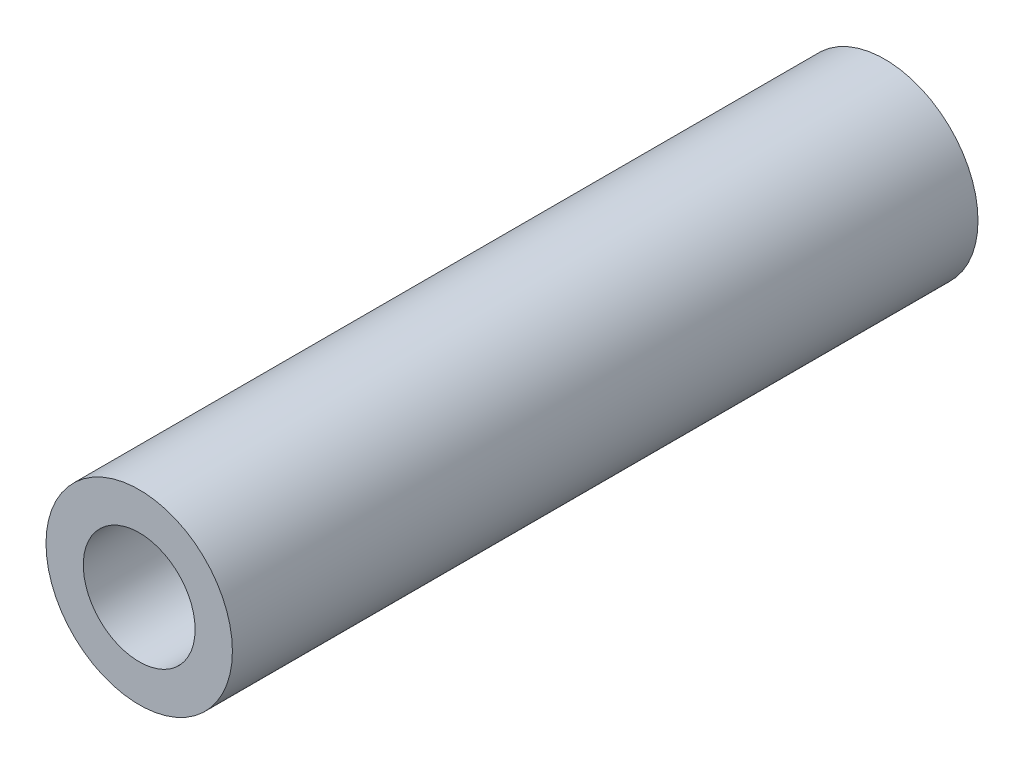
ISO-10303-21;
HEADER;
FILE_DESCRIPTION(('STEP AP214'),'2;1');
FILE_NAME('part.step','',(''),(''),'','','');
FILE_SCHEMA(('AUTOMOTIVE_DESIGN { 1 0 10303 214 1 1 1 1 }'));
ENDSEC;
DATA;
#1=APPLICATION_CONTEXT('core data for automotive mechanical design processes');
#2=APPLICATION_PROTOCOL_DEFINITION('international standard','automotive_design',2000,#1);
#3=PRODUCT_CONTEXT('',#1,'mechanical');
#4=PRODUCT('Part','Part','',(#3));
#5=PRODUCT_RELATED_PRODUCT_CATEGORY('part','',(#4));
#6=PRODUCT_DEFINITION_FORMATION('','',#4);
#7=PRODUCT_DEFINITION_CONTEXT('part definition',#1,'design');
#8=PRODUCT_DEFINITION('design','',#6,#7);
#9=PRODUCT_DEFINITION_SHAPE('','',#8);
#10=(LENGTH_UNIT() NAMED_UNIT(*) SI_UNIT(.MILLI.,.METRE.));
#11=(NAMED_UNIT(*) PLANE_ANGLE_UNIT() SI_UNIT($,.RADIAN.));
#12=(NAMED_UNIT(*) SI_UNIT($,.STERADIAN.) SOLID_ANGLE_UNIT());
#13=UNCERTAINTY_MEASURE_WITH_UNIT(LENGTH_MEASURE(1.E-05),#10,'distance_accuracy_value','');
#14=(GEOMETRIC_REPRESENTATION_CONTEXT(3) GLOBAL_UNCERTAINTY_ASSIGNED_CONTEXT((#13)) GLOBAL_UNIT_ASSIGNED_CONTEXT((#10,
#11,#12)) REPRESENTATION_CONTEXT('',''));
#15=CARTESIAN_POINT('',(0.,0.,0.));
#16=DIRECTION('',(0.,0.,1.));
#17=DIRECTION('',(1.,0.,0.));
#18=AXIS2_PLACEMENT_3D('',#15,#16,#17);
#19=CARTESIAN_POINT('',(0.,0.,60.));
#20=DIRECTION('',(0.,0.,1.));
#21=DIRECTION('',(1.,0.,0.));
#22=AXIS2_PLACEMENT_3D('',#19,#20,#21);
#23=PLANE('',#22);
#24=CARTESIAN_POINT('',(0.,0.,60.));
#25=DIRECTION('',(0.,0.,1.));
#26=DIRECTION('',(1.,0.,0.));
#27=AXIS2_PLACEMENT_3D('',#24,#25,#26);
#28=CIRCLE('',#27,7.5);
#29=CARTESIAN_POINT('',(7.5,0.,60.));
#30=VERTEX_POINT('',#29);
#31=EDGE_CURVE('E10',#30,#30,#28,.T.);
#32=ORIENTED_EDGE('',*,*,#31,.T.);
#33=EDGE_LOOP('',(#32));
#34=FACE_BOUND('',#33,.T.);
#35=CARTESIAN_POINT('',(0.,0.,60.));
#36=DIRECTION('',(0.,0.,1.));
#37=DIRECTION('',(1.,0.,0.));
#38=AXIS2_PLACEMENT_3D('',#35,#36,#37);
#39=CIRCLE('',#38,4.5);
#40=CARTESIAN_POINT('',(4.5,0.,60.));
#41=VERTEX_POINT('',#40);
#42=EDGE_CURVE('E50',#41,#41,#39,.T.);
#43=ORIENTED_EDGE('',*,*,#42,.F.);
#44=EDGE_LOOP('',(#43));
#45=FACE_BOUND('',#44,.T.);
#46=ADVANCED_FACE('F37',(#34,#45),#23,.T.);
#47=CARTESIAN_POINT('',(0.,0.,0.));
#48=DIRECTION('',(0.,0.,1.));
#49=DIRECTION('',(1.,0.,0.));
#50=AXIS2_PLACEMENT_3D('',#47,#48,#49);
#51=PLANE('',#50);
#52=CARTESIAN_POINT('',(0.,0.,0.));
#53=DIRECTION('',(0.,0.,1.));
#54=DIRECTION('',(1.,0.,0.));
#55=AXIS2_PLACEMENT_3D('',#52,#53,#54);
#56=CIRCLE('',#55,7.5);
#57=CARTESIAN_POINT('',(7.5,0.,0.));
#58=VERTEX_POINT('',#57);
#59=EDGE_CURVE('E41',#58,#58,#56,.T.);
#60=ORIENTED_EDGE('',*,*,#59,.F.);
#61=EDGE_LOOP('',(#60));
#62=FACE_BOUND('',#61,.T.);
#63=CARTESIAN_POINT('',(0.,0.,0.));
#64=DIRECTION('',(0.,0.,1.));
#65=DIRECTION('',(1.,0.,0.));
#66=AXIS2_PLACEMENT_3D('',#63,#64,#65);
#67=CIRCLE('',#66,4.5);
#68=CARTESIAN_POINT('',(4.5,0.,0.));
#69=VERTEX_POINT('',#68);
#70=EDGE_CURVE('E52',#69,#69,#67,.T.);
#71=ORIENTED_EDGE('',*,*,#70,.T.);
#72=EDGE_LOOP('',(#71));
#73=FACE_BOUND('',#72,.T.);
#74=ADVANCED_FACE('F64',(#62,#73),#51,.F.);
#75=CARTESIAN_POINT('',(0.,0.,60.));
#76=DIRECTION('',(0.,0.,-1.));
#77=DIRECTION('',(-1.,0.,0.));
#78=AXIS2_PLACEMENT_3D('',#75,#76,#77);
#79=CYLINDRICAL_SURFACE('',#78,7.5);
#80=ORIENTED_EDGE('',*,*,#31,.F.);
#81=EDGE_LOOP('',(#80));
#82=FACE_BOUND('',#81,.T.);
#83=ORIENTED_EDGE('',*,*,#59,.T.);
#84=EDGE_LOOP('',(#83));
#85=FACE_BOUND('',#84,.T.);
#86=ADVANCED_FACE('F39',(#82,#85),#79,.T.);
#87=CARTESIAN_POINT('',(0.,0.,60.));
#88=DIRECTION('',(0.,0.,-1.));
#89=DIRECTION('',(-1.,0.,0.));
#90=AXIS2_PLACEMENT_3D('',#87,#88,#89);
#91=CYLINDRICAL_SURFACE('',#90,4.5);
#92=ORIENTED_EDGE('',*,*,#42,.T.);
#93=EDGE_LOOP('',(#92));
#94=FACE_BOUND('',#93,.T.);
#95=ORIENTED_EDGE('',*,*,#70,.F.);
#96=EDGE_LOOP('',(#95));
#97=FACE_BOUND('',#96,.T.);
#98=ADVANCED_FACE('F60',(#94,#97),#91,.F.);
#99=CLOSED_SHELL('',(#46,#74,#86,#98));
#100=MANIFOLD_SOLID_BREP('B2',#99);
#101=ADVANCED_BREP_SHAPE_REPRESENTATION('',(#18,#100),#14);
#102=SHAPE_DEFINITION_REPRESENTATION(#9,#101);
ENDSEC;
END-ISO-10303-21;
